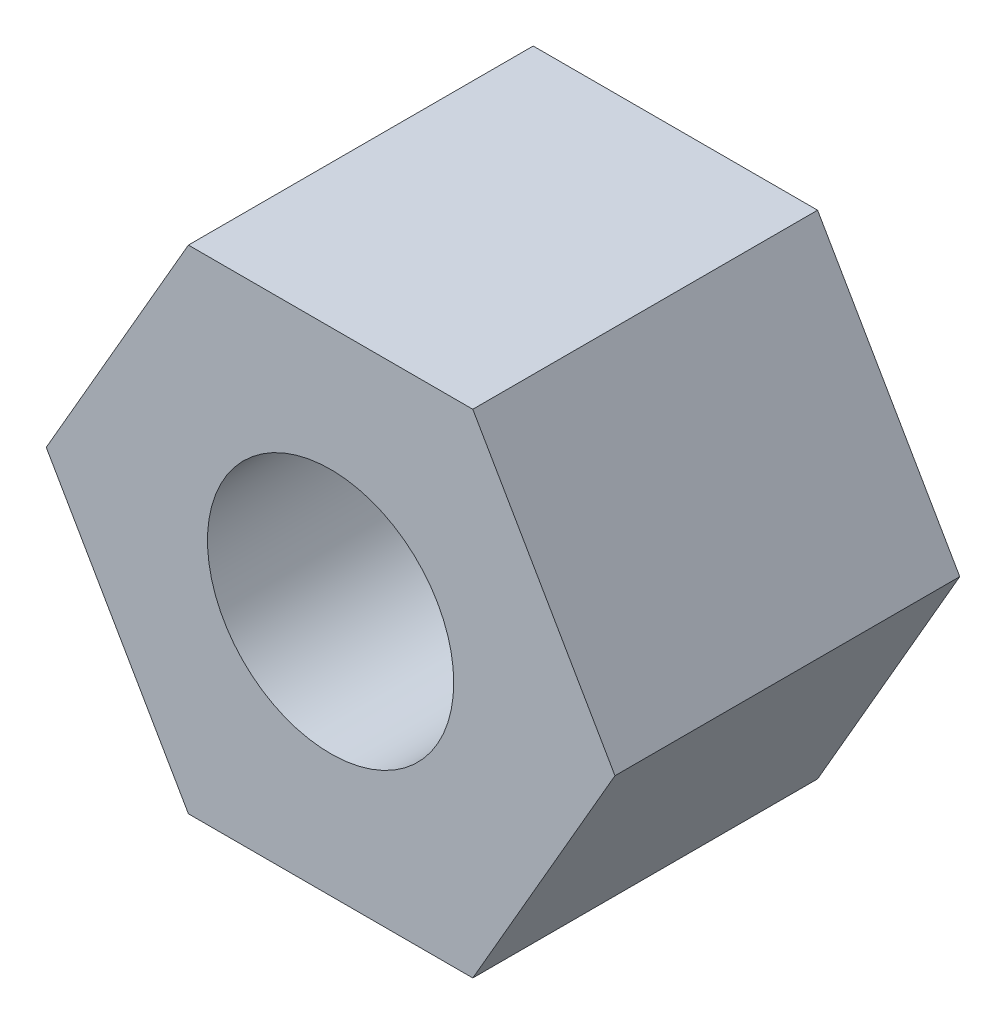
ISO-10303-21;
HEADER;
FILE_DESCRIPTION(('STEP AP214'),'2;1');
FILE_NAME('part.step','',(''),(''),'','','');
FILE_SCHEMA(('AUTOMOTIVE_DESIGN { 1 0 10303 214 1 1 1 1 }'));
ENDSEC;
DATA;
#1=APPLICATION_CONTEXT('core data for automotive mechanical design processes');
#2=APPLICATION_PROTOCOL_DEFINITION('international standard','automotive_design',2000,#1);
#3=PRODUCT_CONTEXT('',#1,'mechanical');
#4=PRODUCT('Part','Part','',(#3));
#5=PRODUCT_RELATED_PRODUCT_CATEGORY('part','',(#4));
#6=PRODUCT_DEFINITION_FORMATION('','',#4);
#7=PRODUCT_DEFINITION_CONTEXT('part definition',#1,'design');
#8=PRODUCT_DEFINITION('design','',#6,#7);
#9=PRODUCT_DEFINITION_SHAPE('','',#8);
#10=(LENGTH_UNIT() NAMED_UNIT(*) SI_UNIT(.MILLI.,.METRE.));
#11=(NAMED_UNIT(*) PLANE_ANGLE_UNIT() SI_UNIT($,.RADIAN.));
#12=(NAMED_UNIT(*) SI_UNIT($,.STERADIAN.) SOLID_ANGLE_UNIT());
#13=UNCERTAINTY_MEASURE_WITH_UNIT(LENGTH_MEASURE(1.E-05),#10,'distance_accuracy_value','');
#14=(GEOMETRIC_REPRESENTATION_CONTEXT(3) GLOBAL_UNCERTAINTY_ASSIGNED_CONTEXT((#13)) GLOBAL_UNIT_ASSIGNED_CONTEXT((#10,
#11,#12)) REPRESENTATION_CONTEXT('',''));
#15=CARTESIAN_POINT('',(0.,0.,0.));
#16=DIRECTION('',(0.,0.,1.));
#17=DIRECTION('',(1.,0.,0.));
#18=AXIS2_PLACEMENT_3D('',#15,#16,#17);
#19=CARTESIAN_POINT('',(0.,0.,3.5));
#20=DIRECTION('',(0.,0.,1.));
#21=DIRECTION('',(1.,0.,0.));
#22=AXIS2_PLACEMENT_3D('',#19,#20,#21);
#23=PLANE('',#22);
#24=DIRECTION('',(0.5,0.866025403784439,0.));
#25=VECTOR('',#24,1.);
#26=CARTESIAN_POINT('',(1.44337567297406,-2.5,3.5));
#27=LINE('',#26,#25);
#28=CARTESIAN_POINT('',(1.44337567297406,-2.5,3.5));
#29=VERTEX_POINT('',#28);
#30=CARTESIAN_POINT('',(2.88675134594813,0.,3.5));
#31=VERTEX_POINT('',#30);
#32=EDGE_CURVE('E137',#29,#31,#27,.T.);
#33=ORIENTED_EDGE('',*,*,#32,.T.);
#34=DIRECTION('',(-0.5,0.866025403784439,0.));
#35=VECTOR('',#34,1.);
#36=CARTESIAN_POINT('',(2.88675134594813,0.,3.5));
#37=LINE('',#36,#35);
#38=CARTESIAN_POINT('',(1.44337567297406,2.5,3.5));
#39=VERTEX_POINT('',#38);
#40=EDGE_CURVE('E100',#31,#39,#37,.T.);
#41=ORIENTED_EDGE('',*,*,#40,.T.);
#42=DIRECTION('',(-1.,0.,0.));
#43=VECTOR('',#42,1.);
#44=CARTESIAN_POINT('',(1.44337567297406,2.5,3.5));
#45=LINE('',#44,#43);
#46=CARTESIAN_POINT('',(-1.44337567297406,2.5,3.5));
#47=VERTEX_POINT('',#46);
#48=EDGE_CURVE('E110',#39,#47,#45,.T.);
#49=ORIENTED_EDGE('',*,*,#48,.T.);
#50=DIRECTION('',(-0.5,-0.866025403784439,0.));
#51=VECTOR('',#50,1.);
#52=CARTESIAN_POINT('',(-1.44337567297406,2.5,3.5));
#53=LINE('',#52,#51);
#54=CARTESIAN_POINT('',(-2.88675134594813,0.,3.5));
#55=VERTEX_POINT('',#54);
#56=EDGE_CURVE('E101',#47,#55,#53,.T.);
#57=ORIENTED_EDGE('',*,*,#56,.T.);
#58=DIRECTION('',(0.5,-0.866025403784439,0.));
#59=VECTOR('',#58,1.);
#60=CARTESIAN_POINT('',(-2.88675134594813,0.,3.5));
#61=LINE('',#60,#59);
#62=CARTESIAN_POINT('',(-1.44337567297407,-2.5,3.5));
#63=VERTEX_POINT('',#62);
#64=EDGE_CURVE('E109',#55,#63,#61,.T.);
#65=ORIENTED_EDGE('',*,*,#64,.T.);
#66=DIRECTION('',(1.,0.,0.));
#67=VECTOR('',#66,1.);
#68=CARTESIAN_POINT('',(-1.44337567297407,-2.5,3.5));
#69=LINE('',#68,#67);
#70=EDGE_CURVE('E58',#63,#29,#69,.T.);
#71=ORIENTED_EDGE('',*,*,#70,.T.);
#72=EDGE_LOOP('',(#33,#41,#49,#57,#65,#71));
#73=FACE_BOUND('',#72,.T.);
#74=CARTESIAN_POINT('',(0.,0.,3.5));
#75=DIRECTION('',(0.,0.,1.));
#76=DIRECTION('',(1.,0.,0.));
#77=AXIS2_PLACEMENT_3D('',#74,#75,#76);
#78=CIRCLE('',#77,1.25);
#79=CARTESIAN_POINT('',(1.25,0.,3.5));
#80=VERTEX_POINT('',#79);
#81=EDGE_CURVE('E135',#80,#80,#78,.T.);
#82=ORIENTED_EDGE('',*,*,#81,.F.);
#83=EDGE_LOOP('',(#82));
#84=FACE_BOUND('',#83,.T.);
#85=ADVANCED_FACE('F43',(#73,#84),#23,.T.);
#86=CARTESIAN_POINT('',(0.,0.,0.));
#87=DIRECTION('',(0.,0.,1.));
#88=DIRECTION('',(1.,0.,0.));
#89=AXIS2_PLACEMENT_3D('',#86,#87,#88);
#90=PLANE('',#89);
#91=DIRECTION('',(0.5,0.866025403784439,0.));
#92=VECTOR('',#91,1.);
#93=CARTESIAN_POINT('',(1.44337567297406,-2.5,0.));
#94=LINE('',#93,#92);
#95=CARTESIAN_POINT('',(1.44337567297406,-2.5,0.));
#96=VERTEX_POINT('',#95);
#97=CARTESIAN_POINT('',(2.88675134594813,0.,0.));
#98=VERTEX_POINT('',#97);
#99=EDGE_CURVE('E126',#96,#98,#94,.T.);
#100=ORIENTED_EDGE('',*,*,#99,.F.);
#101=DIRECTION('',(1.,0.,0.));
#102=VECTOR('',#101,1.);
#103=CARTESIAN_POINT('',(-1.44337567297407,-2.5,0.));
#104=LINE('',#103,#102);
#105=CARTESIAN_POINT('',(-1.44337567297407,-2.5,0.));
#106=VERTEX_POINT('',#105);
#107=EDGE_CURVE('E87',#106,#96,#104,.T.);
#108=ORIENTED_EDGE('',*,*,#107,.F.);
#109=DIRECTION('',(0.5,-0.866025403784439,0.));
#110=VECTOR('',#109,1.);
#111=CARTESIAN_POINT('',(-2.88675134594813,0.,0.));
#112=LINE('',#111,#110);
#113=CARTESIAN_POINT('',(-2.88675134594813,0.,0.));
#114=VERTEX_POINT('',#113);
#115=EDGE_CURVE('E81',#114,#106,#112,.T.);
#116=ORIENTED_EDGE('',*,*,#115,.F.);
#117=DIRECTION('',(-0.5,-0.866025403784439,0.));
#118=VECTOR('',#117,1.);
#119=CARTESIAN_POINT('',(-1.44337567297406,2.5,0.));
#120=LINE('',#119,#118);
#121=CARTESIAN_POINT('',(-1.44337567297406,2.5,0.));
#122=VERTEX_POINT('',#121);
#123=EDGE_CURVE('E119',#122,#114,#120,.T.);
#124=ORIENTED_EDGE('',*,*,#123,.F.);
#125=DIRECTION('',(-1.,0.,0.));
#126=VECTOR('',#125,1.);
#127=CARTESIAN_POINT('',(1.44337567297406,2.5,0.));
#128=LINE('',#127,#126);
#129=CARTESIAN_POINT('',(1.44337567297406,2.5,0.));
#130=VERTEX_POINT('',#129);
#131=EDGE_CURVE('E132',#130,#122,#128,.T.);
#132=ORIENTED_EDGE('',*,*,#131,.F.);
#133=DIRECTION('',(-0.5,0.866025403784439,0.));
#134=VECTOR('',#133,1.);
#135=CARTESIAN_POINT('',(2.88675134594813,0.,0.));
#136=LINE('',#135,#134);
#137=EDGE_CURVE('E131',#98,#130,#136,.T.);
#138=ORIENTED_EDGE('',*,*,#137,.F.);
#139=EDGE_LOOP('',(#100,#108,#116,#124,#132,#138));
#140=FACE_BOUND('',#139,.T.);
#141=CARTESIAN_POINT('',(0.,0.,0.));
#142=DIRECTION('',(0.,0.,1.));
#143=DIRECTION('',(1.,0.,0.));
#144=AXIS2_PLACEMENT_3D('',#141,#142,#143);
#145=CIRCLE('',#144,1.25);
#146=CARTESIAN_POINT('',(1.25,0.,0.));
#147=VERTEX_POINT('',#146);
#148=EDGE_CURVE('E235',#147,#147,#145,.T.);
#149=ORIENTED_EDGE('',*,*,#148,.T.);
#150=EDGE_LOOP('',(#149));
#151=FACE_BOUND('',#150,.T.);
#152=ADVANCED_FACE('F149',(#140,#151),#90,.F.);
#153=CARTESIAN_POINT('',(1.44337567297406,-2.5,3.5));
#154=DIRECTION('',(-0.866025403784439,0.5,0.));
#155=DIRECTION('',(-0.5,-0.866025403784439,0.));
#156=AXIS2_PLACEMENT_3D('',#153,#154,#155);
#157=PLANE('',#156);
#158=ORIENTED_EDGE('',*,*,#99,.T.);
#159=DIRECTION('',(0.,0.,-1.));
#160=VECTOR('',#159,1.);
#161=CARTESIAN_POINT('',(2.88675134594813,0.,3.5));
#162=LINE('',#161,#160);
#163=EDGE_CURVE('E11',#31,#98,#162,.T.);
#164=ORIENTED_EDGE('',*,*,#163,.F.);
#165=ORIENTED_EDGE('',*,*,#32,.F.);
#166=DIRECTION('',(0.,0.,-1.));
#167=VECTOR('',#166,1.);
#168=CARTESIAN_POINT('',(1.44337567297406,-2.5,3.5));
#169=LINE('',#168,#167);
#170=EDGE_CURVE('E125',#29,#96,#169,.T.);
#171=ORIENTED_EDGE('',*,*,#170,.T.);
#172=EDGE_LOOP('',(#158,#164,#165,#171));
#173=FACE_BOUND('',#172,.T.);
#174=ADVANCED_FACE('F44',(#173),#157,.F.);
#175=CARTESIAN_POINT('',(2.88675134594813,0.,3.5));
#176=DIRECTION('',(-0.866025403784439,-0.5,0.));
#177=DIRECTION('',(0.5,-0.866025403784439,0.));
#178=AXIS2_PLACEMENT_3D('',#175,#176,#177);
#179=PLANE('',#178);
#180=ORIENTED_EDGE('',*,*,#137,.T.);
#181=DIRECTION('',(0.,0.,-1.));
#182=VECTOR('',#181,1.);
#183=CARTESIAN_POINT('',(1.44337567297406,2.5,3.5));
#184=LINE('',#183,#182);
#185=EDGE_CURVE('E55',#39,#130,#184,.T.);
#186=ORIENTED_EDGE('',*,*,#185,.F.);
#187=ORIENTED_EDGE('',*,*,#40,.F.);
#188=ORIENTED_EDGE('',*,*,#163,.T.);
#189=EDGE_LOOP('',(#180,#186,#187,#188));
#190=FACE_BOUND('',#189,.T.);
#191=ADVANCED_FACE('F171',(#190),#179,.F.);
#192=CARTESIAN_POINT('',(1.44337567297406,2.5,3.5));
#193=DIRECTION('',(0.,-1.,0.));
#194=DIRECTION('',(1.,0.,0.));
#195=AXIS2_PLACEMENT_3D('',#192,#193,#194);
#196=PLANE('',#195);
#197=ORIENTED_EDGE('',*,*,#131,.T.);
#198=DIRECTION('',(0.,0.,-1.));
#199=VECTOR('',#198,1.);
#200=CARTESIAN_POINT('',(-1.44337567297406,2.5,3.5));
#201=LINE('',#200,#199);
#202=EDGE_CURVE('E118',#47,#122,#201,.T.);
#203=ORIENTED_EDGE('',*,*,#202,.F.);
#204=ORIENTED_EDGE('',*,*,#48,.F.);
#205=ORIENTED_EDGE('',*,*,#185,.T.);
#206=EDGE_LOOP('',(#197,#203,#204,#205));
#207=FACE_BOUND('',#206,.T.);
#208=ADVANCED_FACE('F144',(#207),#196,.F.);
#209=CARTESIAN_POINT('',(-1.44337567297406,2.5,3.5));
#210=DIRECTION('',(0.866025403784438,-0.5,0.));
#211=DIRECTION('',(0.5,0.866025403784439,0.));
#212=AXIS2_PLACEMENT_3D('',#209,#210,#211);
#213=PLANE('',#212);
#214=ORIENTED_EDGE('',*,*,#123,.T.);
#215=DIRECTION('',(0.,0.,-1.));
#216=VECTOR('',#215,1.);
#217=CARTESIAN_POINT('',(-2.88675134594813,0.,3.5));
#218=LINE('',#217,#216);
#219=EDGE_CURVE('E113',#55,#114,#218,.T.);
#220=ORIENTED_EDGE('',*,*,#219,.F.);
#221=ORIENTED_EDGE('',*,*,#56,.F.);
#222=ORIENTED_EDGE('',*,*,#202,.T.);
#223=EDGE_LOOP('',(#214,#220,#221,#222));
#224=FACE_BOUND('',#223,.T.);
#225=ADVANCED_FACE('F116',(#224),#213,.F.);
#226=CARTESIAN_POINT('',(-2.88675134594813,0.,3.5));
#227=DIRECTION('',(0.866025403784439,0.5,0.));
#228=DIRECTION('',(-0.5,0.866025403784439,0.));
#229=AXIS2_PLACEMENT_3D('',#226,#227,#228);
#230=PLANE('',#229);
#231=ORIENTED_EDGE('',*,*,#115,.T.);
#232=DIRECTION('',(0.,0.,-1.));
#233=VECTOR('',#232,1.);
#234=CARTESIAN_POINT('',(-1.44337567297407,-2.5,3.5));
#235=LINE('',#234,#233);
#236=EDGE_CURVE('E120',#63,#106,#235,.T.);
#237=ORIENTED_EDGE('',*,*,#236,.F.);
#238=ORIENTED_EDGE('',*,*,#64,.F.);
#239=ORIENTED_EDGE('',*,*,#219,.T.);
#240=EDGE_LOOP('',(#231,#237,#238,#239));
#241=FACE_BOUND('',#240,.T.);
#242=ADVANCED_FACE('F122',(#241),#230,.F.);
#243=CARTESIAN_POINT('',(-1.44337567297407,-2.5,3.5));
#244=DIRECTION('',(0.,1.,0.));
#245=DIRECTION('',(-1.,0.,0.));
#246=AXIS2_PLACEMENT_3D('',#243,#244,#245);
#247=PLANE('',#246);
#248=ORIENTED_EDGE('',*,*,#107,.T.);
#249=ORIENTED_EDGE('',*,*,#170,.F.);
#250=ORIENTED_EDGE('',*,*,#70,.F.);
#251=ORIENTED_EDGE('',*,*,#236,.T.);
#252=EDGE_LOOP('',(#248,#249,#250,#251));
#253=FACE_BOUND('',#252,.T.);
#254=ADVANCED_FACE('F154',(#253),#247,.F.);
#255=CARTESIAN_POINT('',(0.,0.,3.5));
#256=DIRECTION('',(0.,0.,-1.));
#257=DIRECTION('',(-1.,0.,0.));
#258=AXIS2_PLACEMENT_3D('',#255,#256,#257);
#259=CYLINDRICAL_SURFACE('',#258,1.25);
#260=ORIENTED_EDGE('',*,*,#81,.T.);
#261=EDGE_LOOP('',(#260));
#262=FACE_BOUND('',#261,.T.);
#263=ORIENTED_EDGE('',*,*,#148,.F.);
#264=EDGE_LOOP('',(#263));
#265=FACE_BOUND('',#264,.T.);
#266=ADVANCED_FACE('F155',(#262,#265),#259,.F.);
#267=CLOSED_SHELL('',(#85,#152,#174,#191,#208,#225,#242,#254,#266));
#268=MANIFOLD_SOLID_BREP('B2',#267);
#269=ADVANCED_BREP_SHAPE_REPRESENTATION('',(#18,#268),#14);
#270=SHAPE_DEFINITION_REPRESENTATION(#9,#269);
ENDSEC;
END-ISO-10303-21;
